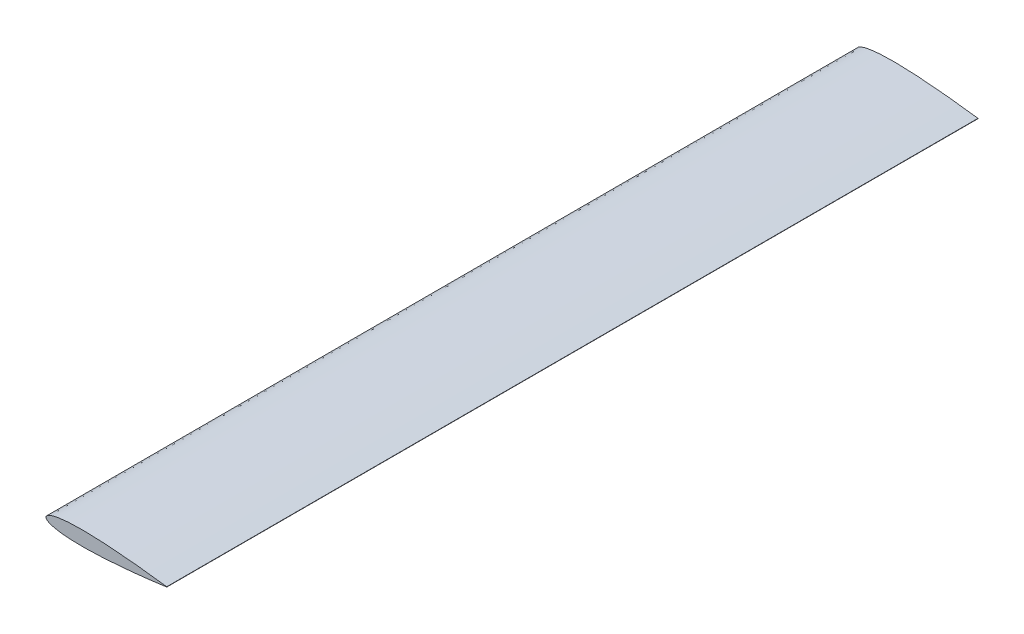
ISO-10303-21;
HEADER;
FILE_DESCRIPTION(('STEP AP214'),'2;1');
FILE_NAME('part.step','',(''),(''),'','','');
FILE_SCHEMA(('AUTOMOTIVE_DESIGN { 1 0 10303 214 1 1 1 1 }'));
ENDSEC;
DATA;
#1=APPLICATION_CONTEXT('core data for automotive mechanical design processes');
#2=APPLICATION_PROTOCOL_DEFINITION('international standard','automotive_design',2000,#1);
#3=PRODUCT_CONTEXT('',#1,'mechanical');
#4=PRODUCT('Part','Part','',(#3));
#5=PRODUCT_RELATED_PRODUCT_CATEGORY('part','',(#4));
#6=PRODUCT_DEFINITION_FORMATION('','',#4);
#7=PRODUCT_DEFINITION_CONTEXT('part definition',#1,'design');
#8=PRODUCT_DEFINITION('design','',#6,#7);
#9=PRODUCT_DEFINITION_SHAPE('','',#8);
#10=(LENGTH_UNIT() NAMED_UNIT(*) SI_UNIT(.MILLI.,.METRE.));
#11=(NAMED_UNIT(*) PLANE_ANGLE_UNIT() SI_UNIT($,.RADIAN.));
#12=(NAMED_UNIT(*) SI_UNIT($,.STERADIAN.) SOLID_ANGLE_UNIT());
#13=UNCERTAINTY_MEASURE_WITH_UNIT(LENGTH_MEASURE(1.E-05),#10,'distance_accuracy_value','');
#14=(GEOMETRIC_REPRESENTATION_CONTEXT(3) GLOBAL_UNCERTAINTY_ASSIGNED_CONTEXT((#13)) GLOBAL_UNIT_ASSIGNED_CONTEXT((#10,
#11,#12)) REPRESENTATION_CONTEXT('',''));
#15=CARTESIAN_POINT('',(0.,0.,0.));
#16=DIRECTION('',(0.,0.,1.));
#17=DIRECTION('',(1.,0.,0.));
#18=AXIS2_PLACEMENT_3D('',#15,#16,#17);
#19=CARTESIAN_POINT('',(25.,0.0315,168.));
#20=CARTESIAN_POINT('',(24.9951340198581,0.0321828083083355,168.));
#21=CARTESIAN_POINT('',(24.9756829736488,0.034912234974769,168.));
#22=CARTESIAN_POINT('',(24.9319602999531,0.0410319642725474,168.));
#23=CARTESIAN_POINT('',(24.7628787473603,0.0646537473655258,168.));
#24=CARTESIAN_POINT('',(24.3943966444581,0.115513521966666,168.));
#25=CARTESIAN_POINT('',(23.9608260633457,0.173893733576008,168.));
#26=CARTESIAN_POINT('',(23.5596151690078,0.226746820071456,168.));
#27=CARTESIAN_POINT('',(23.2662696293432,0.264888121394128,168.));
#28=CARTESIAN_POINT('',(22.2644401932139,0.393245255378652,168.));
#29=CARTESIAN_POINT('',(21.2027283202765,0.520803388471872,168.));
#30=CARTESIAN_POINT('',(19.9153509988953,0.665636111242132,168.));
#31=CARTESIAN_POINT('',(19.0752708190794,0.75686146913503,168.));
#32=CARTESIAN_POINT('',(18.0229714260851,0.865404641484163,168.));
#33=CARTESIAN_POINT('',(16.919108129673,0.972755424172768,168.));
#34=CARTESIAN_POINT('',(15.9714459605271,1.05878472412804,168.));
#35=CARTESIAN_POINT('',(14.9961745622201,1.1420525647307,168.));
#36=CARTESIAN_POINT('',(14.0024138029401,1.22112334286106,168.));
#37=CARTESIAN_POINT('',(13.0024703405824,1.2919035687064,168.));
#38=CARTESIAN_POINT('',(11.997994705569,1.35534688106019,168.));
#39=CARTESIAN_POINT('',(11.1958145003649,1.39943726668631,168.));
#40=CARTESIAN_POINT('',(10.3972617716977,1.43569255775489,168.));
#41=CARTESIAN_POINT('',(9.80487341889431,1.45851619744161,168.));
#42=CARTESIAN_POINT('',(9.21877705786852,1.47675056354873,168.));
#43=CARTESIAN_POINT('',(8.64034122004866,1.49013313084134,168.));
#44=CARTESIAN_POINT('',(8.07091592100561,1.49840812147521,168.));
#45=CARTESIAN_POINT('',(7.51183008176704,1.50135002291991,168.));
#46=CARTESIAN_POINT('',(6.9643893245625,1.49876702049129,168.));
#47=CARTESIAN_POINT('',(6.4298716861771,1.49050661597463,168.));
#48=CARTESIAN_POINT('',(5.90952521515537,1.47643570217502,168.));
#49=CARTESIAN_POINT('',(5.40456371160651,1.4564844200571,168.));
#50=CARTESIAN_POINT('',(4.91616632821543,1.43061011574732,168.));
#51=CARTESIAN_POINT('',(4.44547308743062,1.39880978757429,168.));
#52=CARTESIAN_POINT('',(3.99358103481629,1.36113454767729,168.));
#53=CARTESIAN_POINT('',(3.56154292107623,1.31767402501472,168.));
#54=CARTESIAN_POINT('',(3.15036627435765,1.26854724955998,168.));
#55=CARTESIAN_POINT('',(2.76100588223935,1.21393322887145,168.));
#56=CARTESIAN_POINT('',(2.39436853412753,1.15400904702837,168.));
#57=CARTESIAN_POINT('',(2.05129955842062,1.08902815028254,168.));
#58=CARTESIAN_POINT('',(1.73259226630613,1.01922366817834,168.));
#59=CARTESIAN_POINT('',(1.43897240600781,0.944882345735537,168.));
#60=CARTESIAN_POINT('',(1.17110593316559,0.866273939331833,168.));
#61=CARTESIAN_POINT('',(0.929582246194452,0.783696735636286,168.));
#62=CARTESIAN_POINT('',(0.714917549684845,0.697423484026065,168.));
#63=CARTESIAN_POINT('',(0.527536948596957,0.60771427809462,168.));
#64=CARTESIAN_POINT('',(0.367772948448693,0.514770908069726,168.));
#65=CARTESIAN_POINT('',(0.235859320643097,0.418700069040833,168.));
#66=CARTESIAN_POINT('',(0.131989531331737,0.319408132705423,168.));
#67=CARTESIAN_POINT('',(0.0564969012514598,0.21654883775824,168.));
#68=CARTESIAN_POINT('',(0.0103010381507129,0.109673940473715,168.));
#69=CARTESIAN_POINT('',(-0.00502146509974687,0.,168.));
#70=CARTESIAN_POINT('',(0.0103010381507131,-0.109673940473715,168.));
#71=CARTESIAN_POINT('',(0.0564969012514588,-0.216548837758238,168.));
#72=CARTESIAN_POINT('',(0.13198953133174,-0.319408132705426,168.));
#73=CARTESIAN_POINT('',(0.235859320643096,-0.418700069040833,168.));
#74=CARTESIAN_POINT('',(0.367772948448692,-0.514770908069726,168.));
#75=CARTESIAN_POINT('',(0.527536948596953,-0.607714278094618,168.));
#76=CARTESIAN_POINT('',(0.714917549684852,-0.697423484026068,168.));
#77=CARTESIAN_POINT('',(0.929582246194447,-0.783696735636284,168.));
#78=CARTESIAN_POINT('',(1.17110593316559,-0.866273939331834,168.));
#79=CARTESIAN_POINT('',(1.43897240600781,-0.944882345735537,168.));
#80=CARTESIAN_POINT('',(1.73259226630613,-1.01922366817834,168.));
#81=CARTESIAN_POINT('',(2.05129955842061,-1.08902815028254,168.));
#82=CARTESIAN_POINT('',(2.39436853412753,-1.15400904702837,168.));
#83=CARTESIAN_POINT('',(2.76100588223935,-1.21393322887145,168.));
#84=CARTESIAN_POINT('',(3.15036627435766,-1.26854724955998,168.));
#85=CARTESIAN_POINT('',(3.56154292107623,-1.31767402501472,168.));
#86=CARTESIAN_POINT('',(3.99358103481629,-1.36113454767729,168.));
#87=CARTESIAN_POINT('',(4.44547308743062,-1.39880978757429,168.));
#88=CARTESIAN_POINT('',(4.91616632821543,-1.43061011574732,168.));
#89=CARTESIAN_POINT('',(5.40456371160652,-1.45648442005711,168.));
#90=CARTESIAN_POINT('',(5.90952521515537,-1.47643570217502,168.));
#91=CARTESIAN_POINT('',(6.4298716861771,-1.49050661597463,168.));
#92=CARTESIAN_POINT('',(6.96438932456249,-1.49876702049129,168.));
#93=CARTESIAN_POINT('',(7.51183008176704,-1.50135002291991,168.));
#94=CARTESIAN_POINT('',(8.07091592100561,-1.49840812147521,168.));
#95=CARTESIAN_POINT('',(8.64034122004865,-1.49013313084134,168.));
#96=CARTESIAN_POINT('',(9.21877705786853,-1.47675056354873,168.));
#97=CARTESIAN_POINT('',(9.80487341889431,-1.45851619744161,168.));
#98=CARTESIAN_POINT('',(10.3972617716977,-1.43569255775489,168.));
#99=CARTESIAN_POINT('',(11.1958145003649,-1.39943726668631,168.));
#100=CARTESIAN_POINT('',(11.997994705569,-1.35534688106019,168.));
#101=CARTESIAN_POINT('',(13.0024703405823,-1.29190356870641,168.));
#102=CARTESIAN_POINT('',(14.0024138789938,-1.22112308874518,168.));
#103=CARTESIAN_POINT('',(15.189285077656,-1.12668734661939,168.));
#104=CARTESIAN_POINT('',(16.1644030994035,-1.04158887432695,168.));
#105=CARTESIAN_POINT('',(17.1119185852635,-0.954004593897443,168.));
#106=CARTESIAN_POINT('',(18.1915786639988,-0.84900745933893,168.));
#107=CARTESIAN_POINT('',(19.5517638378549,-0.706838119275793,168.));
#108=CARTESIAN_POINT('',(20.8236962939089,-0.563903209519583,168.));
#109=CARTESIAN_POINT('',(21.9419736390933,-0.431410888130592,168.));
#110=CARTESIAN_POINT('',(22.6958278914478,-0.337974680783209,168.));
#111=CARTESIAN_POINT('',(23.2662696293432,-0.264888121394128,168.));
#112=CARTESIAN_POINT('',(23.7115174084211,-0.206996224607568,168.));
#113=CARTESIAN_POINT('',(24.1655847978855,-0.146539644714369,168.));
#114=CARTESIAN_POINT('',(24.5990380424439,-0.0872991506155019,168.));
#115=CARTESIAN_POINT('',(24.815761384077,-0.0572657020421167,168.));
#116=CARTESIAN_POINT('',(24.9319602999531,-0.0410319642725475,168.));
#117=CARTESIAN_POINT('',(24.9756829736488,-0.0349122349747693,168.));
#118=CARTESIAN_POINT('',(24.9951340198581,-0.0321828083083355,168.));
#119=CARTESIAN_POINT('',(25.,-0.0315,168.));
#120=B_SPLINE_CURVE_WITH_KNOTS('',3,(#19,#20,#21,#22,#23,#24,#25,#26,#27,#28,#29,#30,#31,#32,
#33,#34,#35,#36,#37,#38,#39,#40,#41,#42,#43,#44,#45,#46,#47,#48,#49,#50,#51,#52,#53,#54,#55,#56,
#57,#58,#59,#60,#61,#62,#63,#64,#65,#66,#67,#68,#69,#70,#71,#72,#73,#74,#75,#76,#77,#78,#79,#80,
#81,#82,#83,#84,#85,#86,#87,#88,#89,#90,#91,#92,#93,#94,#95,#96,#97,#98,#99,#100,#101,#102,#103,
#104,#105,#106,#107,#108,#109,#110,#111,#112,#113,#114,#115,#116,#117,#118,#119),.UNSPECIFIED.,
.F.,.F.,(4,1,1,1,1,1,1,1,1,1,1,1,1,1,1,1,1,1,1,1,1,1,1,1,1,1,1,1,1,1,1,1,1,1,1,1,1,1,1,1,1,1,1,
1,1,1,1,1,1,1,1,1,1,1,1,1,1,1,1,1,1,1,1,1,1,1,1,1,1,1,1,1,1,1,1,1,1,1,1,1,1,1,1,1,1,1,1,1,1,1,1,
1,1,1,1,1,1,1,4),(0.,0.000289157089474118,0.00115586330916633,0.00259805876717436,
0.0103358462744862,0.0230457377742648,0.0283428836686461,0.0341501483557849,0.0404537393346738,
0.0877801023888762,0.0970773519152031,0.116690750020973,0.137507311613728,0.159331021819007,
0.181956667595326,0.193504001733211,0.21693215026303,0.24062147148056,0.252494877562422,
0.276160723248583,0.287898269502264,0.299535917539716,0.311046970510736,0.322405027863275,
0.333584243393343,0.344559419732818,0.355305879102253,0.365799644675589,0.376017645463572,
0.385937517863606,0.395537813641388,0.404798066410151,0.41369880992526,0.422221683237475,
0.430349464839536,0.438066152610253,0.445357160907796,0.452209437176443,0.458611487663545,
0.464554011593151,0.470029939859423,0.475035092647181,0.479569168875679,0.483636928018542,
0.487250234247951,0.490431505137214,0.493218859081049,0.495674082647599,0.497891237495517,0.5,
0.502108762504483,0.504325917352401,0.506781140918951,0.509568494862786,0.512749765752049,
0.516363071981458,0.520430831124321,0.524964907352819,0.529970060140577,0.535445988406849,
0.541388512336455,0.547790562823557,0.554642839092204,0.561933847389747,0.569650535160464,
0.577778316762525,0.58630119007474,0.595201933589849,0.604462186358612,0.614062482136394,
0.623982354536428,0.634200355324412,0.644694120897747,0.655440580267182,0.666415756606657,
0.677594972136725,0.688953029489264,0.700464082460284,0.712101730497736,0.723839276751417,
0.747505122437578,0.75937852851944,0.78306784973697,0.806495998266789,0.829443250621851,
0.840668978180993,0.862492688386272,0.893278152539754,0.921148048165806,0.937813560612498,
0.959546260665326,0.965849851644215,0.971657116331354,0.985968595369371,0.99280639725374,
0.997401941232826,0.998844136690834,0.999710842910526,1.),.UNSPECIFIED.);
#121=DIRECTION('',(0.,0.,-1.));
#122=VECTOR('',#121,1.);
#123=SURFACE_OF_LINEAR_EXTRUSION('',#120,#122);
#124=CARTESIAN_POINT('',(25.,0.0315,0.));
#125=CARTESIAN_POINT('',(24.9951340198581,0.0321828083083355,0.));
#126=CARTESIAN_POINT('',(24.9756829736488,0.034912234974769,0.));
#127=CARTESIAN_POINT('',(24.9319602999531,0.0410319642725474,0.));
#128=CARTESIAN_POINT('',(24.7628787473603,0.0646537473655258,0.));
#129=CARTESIAN_POINT('',(24.3943966444581,0.115513521966666,0.));
#130=CARTESIAN_POINT('',(23.9608260633457,0.173893733576008,0.));
#131=CARTESIAN_POINT('',(23.5596151690078,0.226746820071456,0.));
#132=CARTESIAN_POINT('',(23.2662696293432,0.264888121394128,0.));
#133=CARTESIAN_POINT('',(22.2644401932139,0.393245255378652,0.));
#134=CARTESIAN_POINT('',(21.2027283202765,0.520803388471872,0.));
#135=CARTESIAN_POINT('',(19.9153509988953,0.665636111242132,0.));
#136=CARTESIAN_POINT('',(19.0752708190794,0.75686146913503,0.));
#137=CARTESIAN_POINT('',(18.0229714260851,0.865404641484163,0.));
#138=CARTESIAN_POINT('',(16.919108129673,0.972755424172768,0.));
#139=CARTESIAN_POINT('',(15.9714459605271,1.05878472412804,0.));
#140=CARTESIAN_POINT('',(14.9961745622201,1.1420525647307,0.));
#141=CARTESIAN_POINT('',(14.0024138029401,1.22112334286106,0.));
#142=CARTESIAN_POINT('',(13.0024703405824,1.2919035687064,0.));
#143=CARTESIAN_POINT('',(11.997994705569,1.35534688106019,0.));
#144=CARTESIAN_POINT('',(11.1958145003649,1.39943726668631,0.));
#145=CARTESIAN_POINT('',(10.3972617716977,1.43569255775489,0.));
#146=CARTESIAN_POINT('',(9.80487341889431,1.45851619744161,0.));
#147=CARTESIAN_POINT('',(9.21877705786852,1.47675056354873,0.));
#148=CARTESIAN_POINT('',(8.64034122004866,1.49013313084134,0.));
#149=CARTESIAN_POINT('',(8.07091592100561,1.49840812147521,0.));
#150=CARTESIAN_POINT('',(7.51183008176704,1.50135002291991,0.));
#151=CARTESIAN_POINT('',(6.9643893245625,1.49876702049129,0.));
#152=CARTESIAN_POINT('',(6.4298716861771,1.49050661597463,0.));
#153=CARTESIAN_POINT('',(5.90952521515537,1.47643570217502,0.));
#154=CARTESIAN_POINT('',(5.40456371160651,1.4564844200571,0.));
#155=CARTESIAN_POINT('',(4.91616632821543,1.43061011574732,0.));
#156=CARTESIAN_POINT('',(4.44547308743062,1.39880978757429,0.));
#157=CARTESIAN_POINT('',(3.99358103481629,1.36113454767729,0.));
#158=CARTESIAN_POINT('',(3.56154292107623,1.31767402501472,0.));
#159=CARTESIAN_POINT('',(3.15036627435765,1.26854724955998,0.));
#160=CARTESIAN_POINT('',(2.76100588223935,1.21393322887145,0.));
#161=CARTESIAN_POINT('',(2.39436853412753,1.15400904702837,0.));
#162=CARTESIAN_POINT('',(2.05129955842062,1.08902815028254,0.));
#163=CARTESIAN_POINT('',(1.73259226630613,1.01922366817834,0.));
#164=CARTESIAN_POINT('',(1.43897240600781,0.944882345735537,0.));
#165=CARTESIAN_POINT('',(1.17110593316559,0.866273939331833,0.));
#166=CARTESIAN_POINT('',(0.929582246194452,0.783696735636286,0.));
#167=CARTESIAN_POINT('',(0.714917549684845,0.697423484026065,0.));
#168=CARTESIAN_POINT('',(0.527536948596957,0.60771427809462,0.));
#169=CARTESIAN_POINT('',(0.367772948448693,0.514770908069726,0.));
#170=CARTESIAN_POINT('',(0.235859320643097,0.418700069040833,0.));
#171=CARTESIAN_POINT('',(0.131989531331737,0.319408132705423,0.));
#172=CARTESIAN_POINT('',(0.0564969012514598,0.21654883775824,0.));
#173=CARTESIAN_POINT('',(0.0103010381507129,0.109673940473715,0.));
#174=CARTESIAN_POINT('',(-0.00502146509974687,0.,0.));
#175=CARTESIAN_POINT('',(0.0103010381507131,-0.109673940473715,0.));
#176=CARTESIAN_POINT('',(0.0564969012514588,-0.216548837758238,0.));
#177=CARTESIAN_POINT('',(0.13198953133174,-0.319408132705426,0.));
#178=CARTESIAN_POINT('',(0.235859320643096,-0.418700069040833,0.));
#179=CARTESIAN_POINT('',(0.367772948448692,-0.514770908069726,0.));
#180=CARTESIAN_POINT('',(0.527536948596953,-0.607714278094618,0.));
#181=CARTESIAN_POINT('',(0.714917549684852,-0.697423484026068,0.));
#182=CARTESIAN_POINT('',(0.929582246194447,-0.783696735636284,0.));
#183=CARTESIAN_POINT('',(1.17110593316559,-0.866273939331834,0.));
#184=CARTESIAN_POINT('',(1.43897240600781,-0.944882345735537,0.));
#185=CARTESIAN_POINT('',(1.73259226630613,-1.01922366817834,0.));
#186=CARTESIAN_POINT('',(2.05129955842061,-1.08902815028254,0.));
#187=CARTESIAN_POINT('',(2.39436853412753,-1.15400904702837,0.));
#188=CARTESIAN_POINT('',(2.76100588223935,-1.21393322887145,0.));
#189=CARTESIAN_POINT('',(3.15036627435766,-1.26854724955998,0.));
#190=CARTESIAN_POINT('',(3.56154292107623,-1.31767402501472,0.));
#191=CARTESIAN_POINT('',(3.99358103481629,-1.36113454767729,0.));
#192=CARTESIAN_POINT('',(4.44547308743062,-1.39880978757429,0.));
#193=CARTESIAN_POINT('',(4.91616632821543,-1.43061011574732,0.));
#194=CARTESIAN_POINT('',(5.40456371160652,-1.45648442005711,0.));
#195=CARTESIAN_POINT('',(5.90952521515537,-1.47643570217502,0.));
#196=CARTESIAN_POINT('',(6.4298716861771,-1.49050661597463,0.));
#197=CARTESIAN_POINT('',(6.96438932456249,-1.49876702049129,0.));
#198=CARTESIAN_POINT('',(7.51183008176704,-1.50135002291991,0.));
#199=CARTESIAN_POINT('',(8.07091592100561,-1.49840812147521,0.));
#200=CARTESIAN_POINT('',(8.64034122004865,-1.49013313084134,0.));
#201=CARTESIAN_POINT('',(9.21877705786853,-1.47675056354873,0.));
#202=CARTESIAN_POINT('',(9.80487341889431,-1.45851619744161,0.));
#203=CARTESIAN_POINT('',(10.3972617716977,-1.43569255775489,0.));
#204=CARTESIAN_POINT('',(11.1958145003649,-1.39943726668631,0.));
#205=CARTESIAN_POINT('',(11.997994705569,-1.35534688106019,0.));
#206=CARTESIAN_POINT('',(13.0024703405823,-1.29190356870641,0.));
#207=CARTESIAN_POINT('',(14.0024138789938,-1.22112308874518,0.));
#208=CARTESIAN_POINT('',(15.189285077656,-1.12668734661939,0.));
#209=CARTESIAN_POINT('',(16.1644030994035,-1.04158887432695,0.));
#210=CARTESIAN_POINT('',(17.1119185852635,-0.954004593897443,0.));
#211=CARTESIAN_POINT('',(18.1915786639988,-0.84900745933893,0.));
#212=CARTESIAN_POINT('',(19.5517638378549,-0.706838119275793,0.));
#213=CARTESIAN_POINT('',(20.8236962939089,-0.563903209519583,0.));
#214=CARTESIAN_POINT('',(21.9419736390933,-0.431410888130592,0.));
#215=CARTESIAN_POINT('',(22.6958278914478,-0.337974680783209,0.));
#216=CARTESIAN_POINT('',(23.2662696293432,-0.264888121394128,0.));
#217=CARTESIAN_POINT('',(23.7115174084211,-0.206996224607568,0.));
#218=CARTESIAN_POINT('',(24.1655847978855,-0.146539644714369,0.));
#219=CARTESIAN_POINT('',(24.5990380424439,-0.0872991506155019,0.));
#220=CARTESIAN_POINT('',(24.815761384077,-0.0572657020421167,0.));
#221=CARTESIAN_POINT('',(24.9319602999531,-0.0410319642725475,0.));
#222=CARTESIAN_POINT('',(24.9756829736488,-0.0349122349747693,0.));
#223=CARTESIAN_POINT('',(24.9951340198581,-0.0321828083083355,0.));
#224=CARTESIAN_POINT('',(25.,-0.0315,0.));
#225=B_SPLINE_CURVE_WITH_KNOTS('',3,(#124,#125,#126,#127,#128,#129,#130,#131,#132,#133,#134,
#135,#136,#137,#138,#139,#140,#141,#142,#143,#144,#145,#146,#147,#148,#149,#150,#151,#152,#153,
#154,#155,#156,#157,#158,#159,#160,#161,#162,#163,#164,#165,#166,#167,#168,#169,#170,#171,#172,
#173,#174,#175,#176,#177,#178,#179,#180,#181,#182,#183,#184,#185,#186,#187,#188,#189,#190,#191,
#192,#193,#194,#195,#196,#197,#198,#199,#200,#201,#202,#203,#204,#205,#206,#207,#208,#209,#210,
#211,#212,#213,#214,#215,#216,#217,#218,#219,#220,#221,#222,#223,#224),.UNSPECIFIED.,.F.,.F.,(4,
1,1,1,1,1,1,1,1,1,1,1,1,1,1,1,1,1,1,1,1,1,1,1,1,1,1,1,1,1,1,1,1,1,1,1,1,1,1,1,1,1,1,1,1,1,1,1,1,
1,1,1,1,1,1,1,1,1,1,1,1,1,1,1,1,1,1,1,1,1,1,1,1,1,1,1,1,1,1,1,1,1,1,1,1,1,1,1,1,1,1,1,1,1,1,1,1,
1,4),(0.,0.000289157089474118,0.00115586330916633,0.00259805876717436,0.0103358462744862,
0.0230457377742648,0.0283428836686461,0.0341501483557849,0.0404537393346738,0.0877801023888762,
0.0970773519152031,0.116690750020973,0.137507311613728,0.159331021819007,0.181956667595326,
0.193504001733211,0.21693215026303,0.24062147148056,0.252494877562422,0.276160723248583,
0.287898269502264,0.299535917539716,0.311046970510736,0.322405027863275,0.333584243393343,
0.344559419732818,0.355305879102253,0.365799644675589,0.376017645463572,0.385937517863606,
0.395537813641388,0.404798066410151,0.41369880992526,0.422221683237475,0.430349464839536,
0.438066152610253,0.445357160907796,0.452209437176443,0.458611487663545,0.464554011593151,
0.470029939859423,0.475035092647181,0.479569168875679,0.483636928018542,0.487250234247951,
0.490431505137214,0.493218859081049,0.495674082647599,0.497891237495517,0.5,0.502108762504483,
0.504325917352401,0.506781140918951,0.509568494862786,0.512749765752049,0.516363071981458,
0.520430831124321,0.524964907352819,0.529970060140577,0.535445988406849,0.541388512336455,
0.547790562823557,0.554642839092204,0.561933847389747,0.569650535160464,0.577778316762525,
0.58630119007474,0.595201933589849,0.604462186358612,0.614062482136394,0.623982354536428,
0.634200355324412,0.644694120897747,0.655440580267182,0.666415756606657,0.677594972136725,
0.688953029489264,0.700464082460284,0.712101730497736,0.723839276751417,0.747505122437578,
0.75937852851944,0.78306784973697,0.806495998266789,0.829443250621851,0.840668978180993,
0.862492688386272,0.893278152539754,0.921148048165806,0.937813560612498,0.959546260665326,
0.965849851644215,0.971657116331354,0.985968595369371,0.99280639725374,0.997401941232826,
0.998844136690834,0.999710842910526,1.),.UNSPECIFIED.);
#226=CARTESIAN_POINT('',(25.,0.0315,0.));
#227=VERTEX_POINT('',#226);
#228=CARTESIAN_POINT('',(25.,-0.0315,0.));
#229=VERTEX_POINT('',#228);
#230=EDGE_CURVE('E58',#227,#229,#225,.T.);
#231=ORIENTED_EDGE('',*,*,#230,.T.);
#232=DIRECTION('',(0.,0.,-1.));
#233=VECTOR('',#232,1.);
#234=CARTESIAN_POINT('',(25.,-0.0315,168.));
#235=LINE('',#234,#233);
#236=CARTESIAN_POINT('',(25.,-0.0315,168.));
#237=VERTEX_POINT('',#236);
#238=EDGE_CURVE('E11',#237,#229,#235,.T.);
#239=ORIENTED_EDGE('',*,*,#238,.F.);
#240=CARTESIAN_POINT('',(25.,0.0315,168.));
#241=VERTEX_POINT('',#240);
#242=EDGE_CURVE('E60',#241,#237,#120,.T.);
#243=ORIENTED_EDGE('',*,*,#242,.F.);
#244=DIRECTION('',(0.,0.,-1.));
#245=VECTOR('',#244,1.);
#246=CARTESIAN_POINT('',(25.,0.0315,168.));
#247=LINE('',#246,#245);
#248=EDGE_CURVE('E42',#241,#227,#247,.T.);
#249=ORIENTED_EDGE('',*,*,#248,.T.);
#250=EDGE_LOOP('',(#231,#239,#243,#249));
#251=FACE_BOUND('',#250,.T.);
#252=ADVANCED_FACE('F33',(#251),#123,.F.);
#253=CARTESIAN_POINT('',(25.,0.0315,168.));
#254=DIRECTION('',(1.,0.,0.));
#255=DIRECTION('',(0.,0.,-1.));
#256=AXIS2_PLACEMENT_3D('',#253,#254,#255);
#257=PLANE('',#256);
#258=DIRECTION('',(0.,-1.,0.));
#259=VECTOR('',#258,1.);
#260=CARTESIAN_POINT('',(25.,0.0315,0.));
#261=LINE('',#260,#259);
#262=EDGE_CURVE('E65',#227,#229,#261,.T.);
#263=ORIENTED_EDGE('',*,*,#262,.F.);
#264=ORIENTED_EDGE('',*,*,#248,.F.);
#265=DIRECTION('',(0.,-1.,0.));
#266=VECTOR('',#265,1.);
#267=CARTESIAN_POINT('',(25.,0.0315,168.));
#268=LINE('',#267,#266);
#269=EDGE_CURVE('E62',#241,#237,#268,.T.);
#270=ORIENTED_EDGE('',*,*,#269,.T.);
#271=ORIENTED_EDGE('',*,*,#238,.T.);
#272=EDGE_LOOP('',(#263,#264,#270,#271));
#273=FACE_BOUND('',#272,.T.);
#274=ADVANCED_FACE('F67',(#273),#257,.T.);
#275=CARTESIAN_POINT('',(0.,0.,168.));
#276=DIRECTION('',(0.,0.,-1.));
#277=DIRECTION('',(-1.,0.,0.));
#278=AXIS2_PLACEMENT_3D('',#275,#276,#277);
#279=PLANE('',#278);
#280=ORIENTED_EDGE('',*,*,#242,.T.);
#281=ORIENTED_EDGE('',*,*,#269,.F.);
#282=EDGE_LOOP('',(#280,#281));
#283=FACE_BOUND('',#282,.T.);
#284=ADVANCED_FACE('F82',(#283),#279,.F.);
#285=CARTESIAN_POINT('',(0.,0.,0.));
#286=DIRECTION('',(0.,0.,-1.));
#287=DIRECTION('',(-1.,0.,0.));
#288=AXIS2_PLACEMENT_3D('',#285,#286,#287);
#289=PLANE('',#288);
#290=ORIENTED_EDGE('',*,*,#230,.F.);
#291=ORIENTED_EDGE('',*,*,#262,.T.);
#292=EDGE_LOOP('',(#290,#291));
#293=FACE_BOUND('',#292,.T.);
#294=ADVANCED_FACE('F64',(#293),#289,.T.);
#295=CLOSED_SHELL('',(#252,#274,#284,#294));
#296=MANIFOLD_SOLID_BREP('B2',#295);
#297=ADVANCED_BREP_SHAPE_REPRESENTATION('',(#18,#296),#14);
#298=SHAPE_DEFINITION_REPRESENTATION(#9,#297);
ENDSEC;
END-ISO-10303-21;
